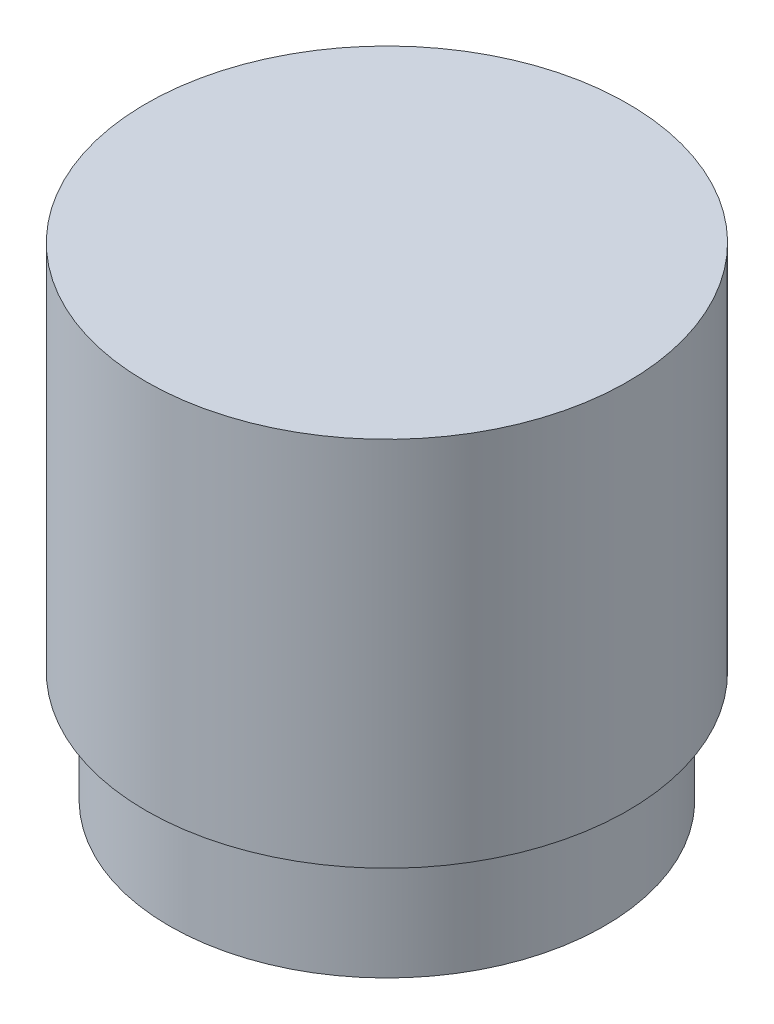
ISO-10303-21;
HEADER;
FILE_DESCRIPTION(('STEP AP214'),'2;1');
FILE_NAME('part.step','',(''),(''),'','','');
FILE_SCHEMA(('AUTOMOTIVE_DESIGN { 1 0 10303 214 1 1 1 1 }'));
ENDSEC;
DATA;
#1=APPLICATION_CONTEXT('core data for automotive mechanical design processes');
#2=APPLICATION_PROTOCOL_DEFINITION('international standard','automotive_design',2000,#1);
#3=PRODUCT_CONTEXT('',#1,'mechanical');
#4=PRODUCT('Part','Part','',(#3));
#5=PRODUCT_RELATED_PRODUCT_CATEGORY('part','',(#4));
#6=PRODUCT_DEFINITION_FORMATION('','',#4);
#7=PRODUCT_DEFINITION_CONTEXT('part definition',#1,'design');
#8=PRODUCT_DEFINITION('design','',#6,#7);
#9=PRODUCT_DEFINITION_SHAPE('','',#8);
#10=(LENGTH_UNIT() NAMED_UNIT(*) SI_UNIT(.MILLI.,.METRE.));
#11=(NAMED_UNIT(*) PLANE_ANGLE_UNIT() SI_UNIT($,.RADIAN.));
#12=(NAMED_UNIT(*) SI_UNIT($,.STERADIAN.) SOLID_ANGLE_UNIT());
#13=UNCERTAINTY_MEASURE_WITH_UNIT(LENGTH_MEASURE(1.E-05),#10,'distance_accuracy_value','');
#14=(GEOMETRIC_REPRESENTATION_CONTEXT(3) GLOBAL_UNCERTAINTY_ASSIGNED_CONTEXT((#13)) GLOBAL_UNIT_ASSIGNED_CONTEXT((#10,
#11,#12)) REPRESENTATION_CONTEXT('',''));
#15=CARTESIAN_POINT('',(0.,0.,0.));
#16=DIRECTION('',(0.,0.,1.));
#17=DIRECTION('',(1.,0.,0.));
#18=AXIS2_PLACEMENT_3D('',#15,#16,#17);
#19=CARTESIAN_POINT('',(0.,0.96,0.));
#20=DIRECTION('',(0.,-1.,0.));
#21=DIRECTION('',(0.,0.,-1.));
#22=AXIS2_PLACEMENT_3D('',#19,#20,#21);
#23=CYLINDRICAL_SURFACE('',#22,1.875);
#24=CARTESIAN_POINT('',(0.,0.96,0.));
#25=DIRECTION('',(0.,1.,0.));
#26=DIRECTION('',(0.,0.,1.));
#27=AXIS2_PLACEMENT_3D('',#24,#25,#26);
#28=CIRCLE('',#27,1.875);
#29=CARTESIAN_POINT('',(0.,0.96,1.875));
#30=VERTEX_POINT('',#29);
#31=EDGE_CURVE('E10',#30,#30,#28,.T.);
#32=ORIENTED_EDGE('',*,*,#31,.F.);
#33=EDGE_LOOP('',(#32));
#34=FACE_BOUND('',#33,.T.);
#35=CARTESIAN_POINT('',(0.,0.,0.));
#36=DIRECTION('',(0.,1.,0.));
#37=DIRECTION('',(0.,0.,1.));
#38=AXIS2_PLACEMENT_3D('',#35,#36,#37);
#39=CIRCLE('',#38,1.875);
#40=CARTESIAN_POINT('',(0.,0.,1.875));
#41=VERTEX_POINT('',#40);
#42=EDGE_CURVE('E41',#41,#41,#39,.T.);
#43=ORIENTED_EDGE('',*,*,#42,.T.);
#44=EDGE_LOOP('',(#43));
#45=FACE_BOUND('',#44,.T.);
#46=ADVANCED_FACE('F38',(#34,#45),#23,.T.);
#47=CARTESIAN_POINT('',(0.,0.,0.));
#48=DIRECTION('',(0.,1.,0.));
#49=DIRECTION('',(0.,0.,1.));
#50=AXIS2_PLACEMENT_3D('',#47,#48,#49);
#51=PLANE('',#50);
#52=ORIENTED_EDGE('',*,*,#42,.F.);
#53=EDGE_LOOP('',(#52));
#54=FACE_BOUND('',#53,.T.);
#55=ADVANCED_FACE('F61',(#54),#51,.F.);
#56=CARTESIAN_POINT('',(0.,4.16,0.));
#57=DIRECTION('',(0.,-1.,0.));
#58=DIRECTION('',(0.,0.,-1.));
#59=AXIS2_PLACEMENT_3D('',#56,#57,#58);
#60=CYLINDRICAL_SURFACE('',#59,2.075);
#61=CARTESIAN_POINT('',(0.,4.16,0.));
#62=DIRECTION('',(0.,1.,0.));
#63=DIRECTION('',(0.,0.,1.));
#64=AXIS2_PLACEMENT_3D('',#61,#62,#63);
#65=CIRCLE('',#64,2.075);
#66=CARTESIAN_POINT('',(0.,4.16,2.075));
#67=VERTEX_POINT('',#66);
#68=EDGE_CURVE('E48',#67,#67,#65,.T.);
#69=ORIENTED_EDGE('',*,*,#68,.F.);
#70=EDGE_LOOP('',(#69));
#71=FACE_BOUND('',#70,.T.);
#72=CARTESIAN_POINT('',(0.,0.96,0.));
#73=DIRECTION('',(0.,1.,0.));
#74=DIRECTION('',(0.,0.,1.));
#75=AXIS2_PLACEMENT_3D('',#72,#73,#74);
#76=CIRCLE('',#75,2.075);
#77=CARTESIAN_POINT('',(0.,0.96,2.075));
#78=VERTEX_POINT('',#77);
#79=EDGE_CURVE('E50',#78,#78,#76,.T.);
#80=ORIENTED_EDGE('',*,*,#79,.T.);
#81=EDGE_LOOP('',(#80));
#82=FACE_BOUND('',#81,.T.);
#83=ADVANCED_FACE('F58',(#71,#82),#60,.T.);
#84=CARTESIAN_POINT('',(0.,4.16,0.));
#85=DIRECTION('',(0.,1.,0.));
#86=DIRECTION('',(0.,0.,1.));
#87=AXIS2_PLACEMENT_3D('',#84,#85,#86);
#88=PLANE('',#87);
#89=ORIENTED_EDGE('',*,*,#68,.T.);
#90=EDGE_LOOP('',(#89));
#91=FACE_BOUND('',#90,.T.);
#92=ADVANCED_FACE('F56',(#91),#88,.T.);
#93=CARTESIAN_POINT('',(0.,0.96,0.));
#94=DIRECTION('',(0.,1.,0.));
#95=DIRECTION('',(0.,0.,1.));
#96=AXIS2_PLACEMENT_3D('',#93,#94,#95);
#97=PLANE('',#96);
#98=ORIENTED_EDGE('',*,*,#31,.T.);
#99=EDGE_LOOP('',(#98));
#100=FACE_BOUND('',#99,.T.);
#101=ORIENTED_EDGE('',*,*,#79,.F.);
#102=EDGE_LOOP('',(#101));
#103=FACE_BOUND('',#102,.T.);
#104=ADVANCED_FACE('F65',(#100,#103),#97,.F.);
#105=CLOSED_SHELL('',(#46,#55,#83,#92,#104));
#106=MANIFOLD_SOLID_BREP('B2',#105);
#107=ADVANCED_BREP_SHAPE_REPRESENTATION('',(#18,#106),#14);
#108=SHAPE_DEFINITION_REPRESENTATION(#9,#107);
ENDSEC;
END-ISO-10303-21;
